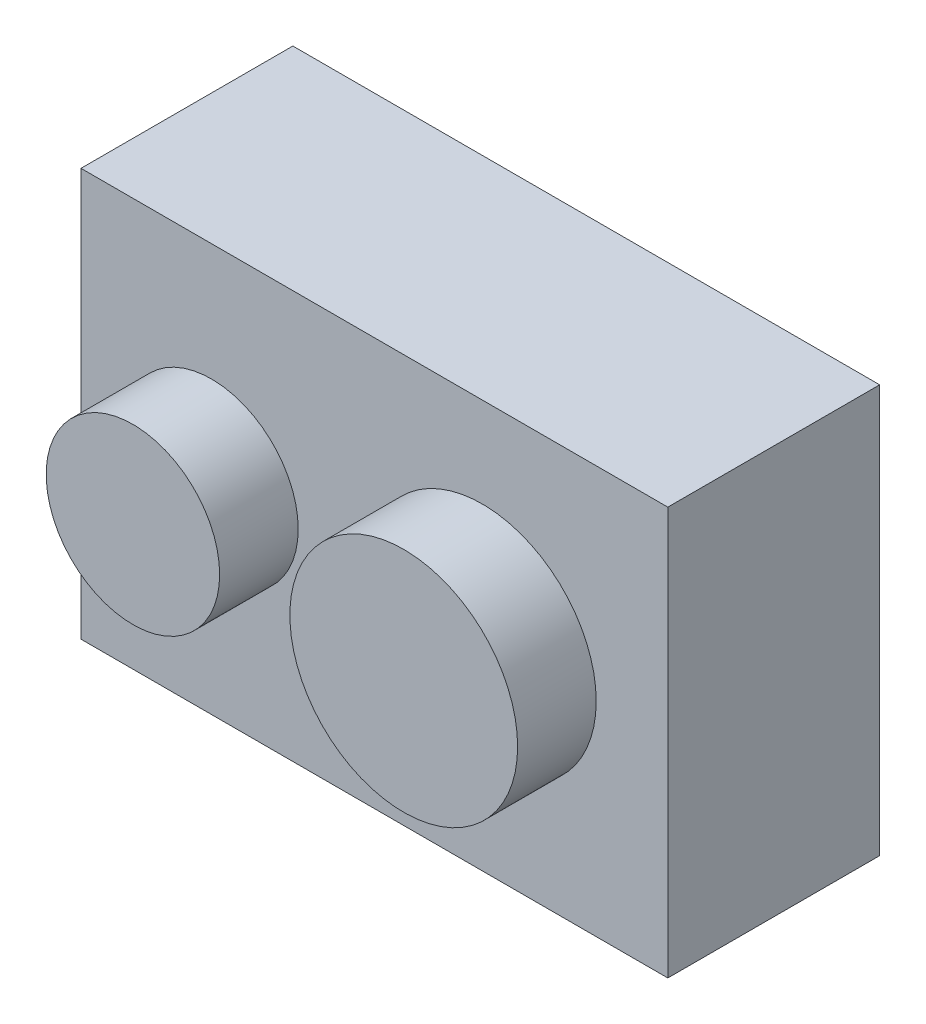
ISO-10303-21;
HEADER;
FILE_DESCRIPTION(('STEP AP214'),'2;1');
FILE_NAME('part.step','',(''),(''),'','','');
FILE_SCHEMA(('AUTOMOTIVE_DESIGN { 1 0 10303 214 1 1 1 1 }'));
ENDSEC;
DATA;
#1=APPLICATION_CONTEXT('core data for automotive mechanical design processes');
#2=APPLICATION_PROTOCOL_DEFINITION('international standard','automotive_design',2000,#1);
#3=PRODUCT_CONTEXT('',#1,'mechanical');
#4=PRODUCT('Part','Part','',(#3));
#5=PRODUCT_RELATED_PRODUCT_CATEGORY('part','',(#4));
#6=PRODUCT_DEFINITION_FORMATION('','',#4);
#7=PRODUCT_DEFINITION_CONTEXT('part definition',#1,'design');
#8=PRODUCT_DEFINITION('design','',#6,#7);
#9=PRODUCT_DEFINITION_SHAPE('','',#8);
#10=(LENGTH_UNIT() NAMED_UNIT(*) SI_UNIT(.MILLI.,.METRE.));
#11=(NAMED_UNIT(*) PLANE_ANGLE_UNIT() SI_UNIT($,.RADIAN.));
#12=(NAMED_UNIT(*) SI_UNIT($,.STERADIAN.) SOLID_ANGLE_UNIT());
#13=UNCERTAINTY_MEASURE_WITH_UNIT(LENGTH_MEASURE(1.E-05),#10,'distance_accuracy_value','');
#14=(GEOMETRIC_REPRESENTATION_CONTEXT(3) GLOBAL_UNCERTAINTY_ASSIGNED_CONTEXT((#13)) GLOBAL_UNIT_ASSIGNED_CONTEXT((#10,
#11,#12)) REPRESENTATION_CONTEXT('',''));
#15=CARTESIAN_POINT('',(0.,0.,0.));
#16=DIRECTION('',(0.,0.,1.));
#17=DIRECTION('',(1.,0.,0.));
#18=AXIS2_PLACEMENT_3D('',#15,#16,#17);
#19=CARTESIAN_POINT('',(-29.5,-20.5,10.65));
#20=DIRECTION('',(1.,0.,0.));
#21=DIRECTION('',(0.,0.,-1.));
#22=AXIS2_PLACEMENT_3D('',#19,#20,#21);
#23=PLANE('',#22);
#24=DIRECTION('',(0.,-1.,0.));
#25=VECTOR('',#24,1.);
#26=CARTESIAN_POINT('',(-29.5,-20.5,-10.65));
#27=LINE('',#26,#25);
#28=CARTESIAN_POINT('',(-29.5,20.5,-10.65));
#29=VERTEX_POINT('',#28);
#30=CARTESIAN_POINT('',(-29.5,-20.5,-10.65));
#31=VERTEX_POINT('',#30);
#32=EDGE_CURVE('E108',#29,#31,#27,.T.);
#33=ORIENTED_EDGE('',*,*,#32,.T.);
#34=DIRECTION('',(0.,0.,-1.));
#35=VECTOR('',#34,1.);
#36=CARTESIAN_POINT('',(-29.5,-20.5,10.65));
#37=LINE('',#36,#35);
#38=CARTESIAN_POINT('',(-29.5,-20.5,10.65));
#39=VERTEX_POINT('',#38);
#40=EDGE_CURVE('E42',#39,#31,#37,.T.);
#41=ORIENTED_EDGE('',*,*,#40,.F.);
#42=DIRECTION('',(0.,-1.,0.));
#43=VECTOR('',#42,1.);
#44=CARTESIAN_POINT('',(-29.5,-20.5,10.65));
#45=LINE('',#44,#43);
#46=CARTESIAN_POINT('',(-29.5,20.5,10.65));
#47=VERTEX_POINT('',#46);
#48=EDGE_CURVE('E94',#47,#39,#45,.T.);
#49=ORIENTED_EDGE('',*,*,#48,.F.);
#50=DIRECTION('',(0.,0.,-1.));
#51=VECTOR('',#50,1.);
#52=CARTESIAN_POINT('',(-29.5,20.5,10.65));
#53=LINE('',#52,#51);
#54=EDGE_CURVE('E101',#47,#29,#53,.T.);
#55=ORIENTED_EDGE('',*,*,#54,.T.);
#56=EDGE_LOOP('',(#33,#41,#49,#55));
#57=FACE_BOUND('',#56,.T.);
#58=ADVANCED_FACE('F41',(#57),#23,.F.);
#59=CARTESIAN_POINT('',(29.5,-20.5,10.65));
#60=DIRECTION('',(0.,1.,0.));
#61=DIRECTION('',(-1.,0.,0.));
#62=AXIS2_PLACEMENT_3D('',#59,#60,#61);
#63=PLANE('',#62);
#64=DIRECTION('',(1.,0.,0.));
#65=VECTOR('',#64,1.);
#66=CARTESIAN_POINT('',(29.5,-20.5,-10.65));
#67=LINE('',#66,#65);
#68=CARTESIAN_POINT('',(29.5,-20.5,-10.65));
#69=VERTEX_POINT('',#68);
#70=EDGE_CURVE('E99',#31,#69,#67,.T.);
#71=ORIENTED_EDGE('',*,*,#70,.T.);
#72=DIRECTION('',(0.,0.,-1.));
#73=VECTOR('',#72,1.);
#74=CARTESIAN_POINT('',(29.5,-20.5,10.65));
#75=LINE('',#74,#73);
#76=CARTESIAN_POINT('',(29.5,-20.5,10.65));
#77=VERTEX_POINT('',#76);
#78=EDGE_CURVE('E97',#77,#69,#75,.T.);
#79=ORIENTED_EDGE('',*,*,#78,.F.);
#80=DIRECTION('',(1.,0.,0.));
#81=VECTOR('',#80,1.);
#82=CARTESIAN_POINT('',(29.5,-20.5,10.65));
#83=LINE('',#82,#81);
#84=EDGE_CURVE('E89',#39,#77,#83,.T.);
#85=ORIENTED_EDGE('',*,*,#84,.F.);
#86=ORIENTED_EDGE('',*,*,#40,.T.);
#87=EDGE_LOOP('',(#71,#79,#85,#86));
#88=FACE_BOUND('',#87,.T.);
#89=ADVANCED_FACE('F98',(#88),#63,.F.);
#90=CARTESIAN_POINT('',(29.5,-20.5,10.65));
#91=DIRECTION('',(-1.,0.,0.));
#92=DIRECTION('',(0.,0.,1.));
#93=AXIS2_PLACEMENT_3D('',#90,#91,#92);
#94=PLANE('',#93);
#95=DIRECTION('',(0.,1.,0.));
#96=VECTOR('',#95,1.);
#97=CARTESIAN_POINT('',(29.5,-20.5,-10.65));
#98=LINE('',#97,#96);
#99=CARTESIAN_POINT('',(29.5,20.5,-10.65));
#100=VERTEX_POINT('',#99);
#101=EDGE_CURVE('E78',#69,#100,#98,.T.);
#102=ORIENTED_EDGE('',*,*,#101,.T.);
#103=DIRECTION('',(0.,0.,-1.));
#104=VECTOR('',#103,1.);
#105=CARTESIAN_POINT('',(29.5,20.5,10.65));
#106=LINE('',#105,#104);
#107=CARTESIAN_POINT('',(29.5,20.5,10.65));
#108=VERTEX_POINT('',#107);
#109=EDGE_CURVE('E102',#108,#100,#106,.T.);
#110=ORIENTED_EDGE('',*,*,#109,.F.);
#111=DIRECTION('',(0.,1.,0.));
#112=VECTOR('',#111,1.);
#113=CARTESIAN_POINT('',(29.5,-20.5,10.65));
#114=LINE('',#113,#112);
#115=EDGE_CURVE('E93',#77,#108,#114,.T.);
#116=ORIENTED_EDGE('',*,*,#115,.F.);
#117=ORIENTED_EDGE('',*,*,#78,.T.);
#118=EDGE_LOOP('',(#102,#110,#116,#117));
#119=FACE_BOUND('',#118,.T.);
#120=ADVANCED_FACE('F105',(#119),#94,.F.);
#121=CARTESIAN_POINT('',(29.5,20.5,10.65));
#122=DIRECTION('',(0.,-1.,0.));
#123=DIRECTION('',(1.,0.,0.));
#124=AXIS2_PLACEMENT_3D('',#121,#122,#123);
#125=PLANE('',#124);
#126=DIRECTION('',(-1.,0.,0.));
#127=VECTOR('',#126,1.);
#128=CARTESIAN_POINT('',(29.5,20.5,-10.65));
#129=LINE('',#128,#127);
#130=EDGE_CURVE('E85',#100,#29,#129,.T.);
#131=ORIENTED_EDGE('',*,*,#130,.T.);
#132=ORIENTED_EDGE('',*,*,#54,.F.);
#133=DIRECTION('',(-1.,0.,0.));
#134=VECTOR('',#133,1.);
#135=CARTESIAN_POINT('',(29.5,20.5,10.65));
#136=LINE('',#135,#134);
#137=EDGE_CURVE('E56',#108,#47,#136,.T.);
#138=ORIENTED_EDGE('',*,*,#137,.F.);
#139=ORIENTED_EDGE('',*,*,#109,.T.);
#140=EDGE_LOOP('',(#131,#132,#138,#139));
#141=FACE_BOUND('',#140,.T.);
#142=ADVANCED_FACE('F117',(#141),#125,.F.);
#143=CARTESIAN_POINT('',(0.,0.,10.65));
#144=DIRECTION('',(0.,0.,1.));
#145=DIRECTION('',(1.,0.,0.));
#146=AXIS2_PLACEMENT_3D('',#143,#144,#145);
#147=PLANE('',#146);
#148=CARTESIAN_POINT('',(10.85,0.,10.65));
#149=DIRECTION('',(0.,0.,1.));
#150=DIRECTION('',(1.,0.,0.));
#151=AXIS2_PLACEMENT_3D('',#148,#149,#150);
#152=CIRCLE('',#151,11.45);
#153=CARTESIAN_POINT('',(22.3,0.,10.65));
#154=VERTEX_POINT('',#153);
#155=EDGE_CURVE('E11',#154,#154,#152,.T.);
#156=ORIENTED_EDGE('',*,*,#155,.F.);
#157=EDGE_LOOP('',(#156));
#158=FACE_BOUND('',#157,.T.);
#159=CARTESIAN_POINT('',(-16.38,0.,10.65));
#160=DIRECTION('',(0.,0.,1.));
#161=DIRECTION('',(1.,0.,0.));
#162=AXIS2_PLACEMENT_3D('',#159,#160,#161);
#163=CIRCLE('',#162,8.72);
#164=CARTESIAN_POINT('',(-7.65999999999999,0.,10.65));
#165=VERTEX_POINT('',#164);
#166=EDGE_CURVE('E49',#165,#165,#163,.T.);
#167=ORIENTED_EDGE('',*,*,#166,.F.);
#168=EDGE_LOOP('',(#167));
#169=FACE_BOUND('',#168,.T.);
#170=ORIENTED_EDGE('',*,*,#48,.T.);
#171=ORIENTED_EDGE('',*,*,#84,.T.);
#172=ORIENTED_EDGE('',*,*,#115,.T.);
#173=ORIENTED_EDGE('',*,*,#137,.T.);
#174=EDGE_LOOP('',(#170,#171,#172,#173));
#175=FACE_BOUND('',#174,.T.);
#176=ADVANCED_FACE('F91',(#158,#169,#175),#147,.T.);
#177=CARTESIAN_POINT('',(0.,0.,-10.65));
#178=DIRECTION('',(0.,0.,1.));
#179=DIRECTION('',(1.,0.,0.));
#180=AXIS2_PLACEMENT_3D('',#177,#178,#179);
#181=PLANE('',#180);
#182=ORIENTED_EDGE('',*,*,#32,.F.);
#183=ORIENTED_EDGE('',*,*,#130,.F.);
#184=ORIENTED_EDGE('',*,*,#101,.F.);
#185=ORIENTED_EDGE('',*,*,#70,.F.);
#186=EDGE_LOOP('',(#182,#183,#184,#185));
#187=FACE_BOUND('',#186,.T.);
#188=ADVANCED_FACE('F119',(#187),#181,.F.);
#189=CARTESIAN_POINT('',(-16.38,0.,18.55));
#190=DIRECTION('',(0.,0.,-1.));
#191=DIRECTION('',(-1.,0.,0.));
#192=AXIS2_PLACEMENT_3D('',#189,#190,#191);
#193=CYLINDRICAL_SURFACE('',#192,8.72);
#194=CARTESIAN_POINT('',(-16.38,0.,18.55));
#195=DIRECTION('',(0.,0.,1.));
#196=DIRECTION('',(1.,0.,0.));
#197=AXIS2_PLACEMENT_3D('',#194,#195,#196);
#198=CIRCLE('',#197,8.72);
#199=CARTESIAN_POINT('',(-7.65999999999999,0.,18.55));
#200=VERTEX_POINT('',#199);
#201=EDGE_CURVE('E122',#200,#200,#198,.T.);
#202=ORIENTED_EDGE('',*,*,#201,.F.);
#203=EDGE_LOOP('',(#202));
#204=FACE_BOUND('',#203,.T.);
#205=ORIENTED_EDGE('',*,*,#166,.T.);
#206=EDGE_LOOP('',(#205));
#207=FACE_BOUND('',#206,.T.);
#208=ADVANCED_FACE('F143',(#204,#207),#193,.T.);
#209=CARTESIAN_POINT('',(-16.38,0.,18.55));
#210=DIRECTION('',(0.,0.,1.));
#211=DIRECTION('',(1.,0.,0.));
#212=AXIS2_PLACEMENT_3D('',#209,#210,#211);
#213=PLANE('',#212);
#214=ORIENTED_EDGE('',*,*,#201,.T.);
#215=EDGE_LOOP('',(#214));
#216=FACE_BOUND('',#215,.T.);
#217=ADVANCED_FACE('F134',(#216),#213,.T.);
#218=CARTESIAN_POINT('',(10.85,0.,18.55));
#219=DIRECTION('',(0.,0.,-1.));
#220=DIRECTION('',(-1.,0.,0.));
#221=AXIS2_PLACEMENT_3D('',#218,#219,#220);
#222=CYLINDRICAL_SURFACE('',#221,11.45);
#223=CARTESIAN_POINT('',(10.85,0.,18.55));
#224=DIRECTION('',(0.,0.,1.));
#225=DIRECTION('',(1.,0.,0.));
#226=AXIS2_PLACEMENT_3D('',#223,#224,#225);
#227=CIRCLE('',#226,11.45);
#228=CARTESIAN_POINT('',(22.3,0.,18.55));
#229=VERTEX_POINT('',#228);
#230=EDGE_CURVE('E112',#229,#229,#227,.T.);
#231=ORIENTED_EDGE('',*,*,#230,.F.);
#232=EDGE_LOOP('',(#231));
#233=FACE_BOUND('',#232,.T.);
#234=ORIENTED_EDGE('',*,*,#155,.T.);
#235=EDGE_LOOP('',(#234));
#236=FACE_BOUND('',#235,.T.);
#237=ADVANCED_FACE('F135',(#233,#236),#222,.T.);
#238=CARTESIAN_POINT('',(10.85,0.,18.55));
#239=DIRECTION('',(0.,0.,1.));
#240=DIRECTION('',(1.,0.,0.));
#241=AXIS2_PLACEMENT_3D('',#238,#239,#240);
#242=PLANE('',#241);
#243=ORIENTED_EDGE('',*,*,#230,.T.);
#244=EDGE_LOOP('',(#243));
#245=FACE_BOUND('',#244,.T.);
#246=ADVANCED_FACE('F127',(#245),#242,.T.);
#247=CLOSED_SHELL('',(#58,#89,#120,#142,#176,#188,#208,#217,#237,#246));
#248=MANIFOLD_SOLID_BREP('B2',#247);
#249=ADVANCED_BREP_SHAPE_REPRESENTATION('',(#18,#248),#14);
#250=SHAPE_DEFINITION_REPRESENTATION(#9,#249);
ENDSEC;
END-ISO-10303-21;
